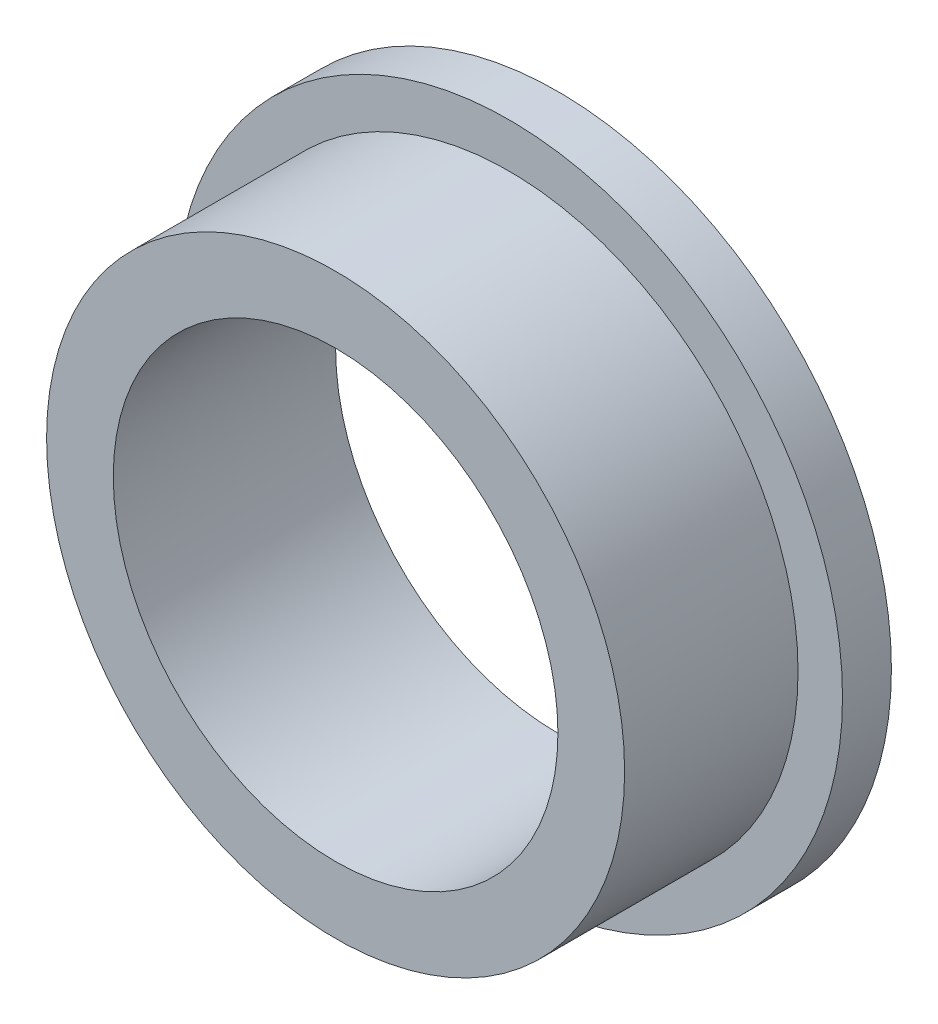
ISO-10303-21;
HEADER;
FILE_DESCRIPTION(('STEP AP214'),'2;1');
FILE_NAME('part.step','',(''),(''),'','','');
FILE_SCHEMA(('AUTOMOTIVE_DESIGN { 1 0 10303 214 1 1 1 1 }'));
ENDSEC;
DATA;
#1=APPLICATION_CONTEXT('core data for automotive mechanical design processes');
#2=APPLICATION_PROTOCOL_DEFINITION('international standard','automotive_design',2000,#1);
#3=PRODUCT_CONTEXT('',#1,'mechanical');
#4=PRODUCT('Part','Part','',(#3));
#5=PRODUCT_RELATED_PRODUCT_CATEGORY('part','',(#4));
#6=PRODUCT_DEFINITION_FORMATION('','',#4);
#7=PRODUCT_DEFINITION_CONTEXT('part definition',#1,'design');
#8=PRODUCT_DEFINITION('design','',#6,#7);
#9=PRODUCT_DEFINITION_SHAPE('','',#8);
#10=(LENGTH_UNIT() NAMED_UNIT(*) SI_UNIT(.MILLI.,.METRE.));
#11=(NAMED_UNIT(*) PLANE_ANGLE_UNIT() SI_UNIT($,.RADIAN.));
#12=(NAMED_UNIT(*) SI_UNIT($,.STERADIAN.) SOLID_ANGLE_UNIT());
#13=UNCERTAINTY_MEASURE_WITH_UNIT(LENGTH_MEASURE(1.E-05),#10,'distance_accuracy_value','');
#14=(GEOMETRIC_REPRESENTATION_CONTEXT(3) GLOBAL_UNCERTAINTY_ASSIGNED_CONTEXT((#13)) GLOBAL_UNIT_ASSIGNED_CONTEXT((#10,
#11,#12)) REPRESENTATION_CONTEXT('',''));
#15=CARTESIAN_POINT('',(0.,0.,0.));
#16=DIRECTION('',(0.,0.,1.));
#17=DIRECTION('',(1.,0.,0.));
#18=AXIS2_PLACEMENT_3D('',#15,#16,#17);
#19=CARTESIAN_POINT('',(0.,0.,5.));
#20=DIRECTION('',(0.,0.,1.));
#21=DIRECTION('',(1.,0.,0.));
#22=AXIS2_PLACEMENT_3D('',#19,#20,#21);
#23=PLANE('',#22);
#24=CARTESIAN_POINT('',(0.,0.,5.));
#25=DIRECTION('',(0.,0.,1.));
#26=DIRECTION('',(1.,0.,0.));
#27=AXIS2_PLACEMENT_3D('',#24,#25,#26);
#28=CIRCLE('',#27,6.5);
#29=CARTESIAN_POINT('',(6.5,0.,5.));
#30=VERTEX_POINT('',#29);
#31=EDGE_CURVE('E10',#30,#30,#28,.T.);
#32=ORIENTED_EDGE('',*,*,#31,.T.);
#33=EDGE_LOOP('',(#32));
#34=FACE_BOUND('',#33,.T.);
#35=CARTESIAN_POINT('',(0.,0.,5.));
#36=DIRECTION('',(0.,0.,1.));
#37=DIRECTION('',(1.,0.,0.));
#38=AXIS2_PLACEMENT_3D('',#35,#36,#37);
#39=CIRCLE('',#38,5.);
#40=CARTESIAN_POINT('',(5.,0.,5.));
#41=VERTEX_POINT('',#40);
#42=EDGE_CURVE('E39',#41,#41,#39,.T.);
#43=ORIENTED_EDGE('',*,*,#42,.F.);
#44=EDGE_LOOP('',(#43));
#45=FACE_BOUND('',#44,.T.);
#46=ADVANCED_FACE('F32',(#34,#45),#23,.T.);
#47=CARTESIAN_POINT('',(0.,0.,0.));
#48=DIRECTION('',(0.,0.,1.));
#49=DIRECTION('',(1.,0.,0.));
#50=AXIS2_PLACEMENT_3D('',#47,#48,#49);
#51=PLANE('',#50);
#52=CARTESIAN_POINT('',(0.,0.,0.));
#53=DIRECTION('',(0.,0.,1.));
#54=DIRECTION('',(1.,0.,0.));
#55=AXIS2_PLACEMENT_3D('',#52,#53,#54);
#56=CIRCLE('',#55,5.);
#57=CARTESIAN_POINT('',(5.,0.,0.));
#58=VERTEX_POINT('',#57);
#59=EDGE_CURVE('E43',#58,#58,#56,.T.);
#60=ORIENTED_EDGE('',*,*,#59,.T.);
#61=EDGE_LOOP('',(#60));
#62=FACE_BOUND('',#61,.T.);
#63=CARTESIAN_POINT('',(0.,0.,0.));
#64=DIRECTION('',(0.,0.,1.));
#65=DIRECTION('',(1.,0.,0.));
#66=AXIS2_PLACEMENT_3D('',#63,#64,#65);
#67=CIRCLE('',#66,7.5);
#68=CARTESIAN_POINT('',(7.5,0.,0.));
#69=VERTEX_POINT('',#68);
#70=EDGE_CURVE('E50',#69,#69,#67,.T.);
#71=ORIENTED_EDGE('',*,*,#70,.F.);
#72=EDGE_LOOP('',(#71));
#73=FACE_BOUND('',#72,.T.);
#74=ADVANCED_FACE('F75',(#62,#73),#51,.F.);
#75=CARTESIAN_POINT('',(0.,0.,5.));
#76=DIRECTION('',(0.,0.,-1.));
#77=DIRECTION('',(-1.,0.,0.));
#78=AXIS2_PLACEMENT_3D('',#75,#76,#77);
#79=CYLINDRICAL_SURFACE('',#78,6.5);
#80=CARTESIAN_POINT('',(0.,0.,1.1));
#81=DIRECTION('',(0.,0.,1.));
#82=DIRECTION('',(1.,0.,0.));
#83=AXIS2_PLACEMENT_3D('',#80,#81,#82);
#84=CIRCLE('',#83,6.5);
#85=CARTESIAN_POINT('',(6.5,0.,1.1));
#86=VERTEX_POINT('',#85);
#87=EDGE_CURVE('E53',#86,#86,#84,.T.);
#88=ORIENTED_EDGE('',*,*,#87,.T.);
#89=EDGE_LOOP('',(#88));
#90=FACE_BOUND('',#89,.T.);
#91=ORIENTED_EDGE('',*,*,#31,.F.);
#92=EDGE_LOOP('',(#91));
#93=FACE_BOUND('',#92,.T.);
#94=ADVANCED_FACE('F34',(#90,#93),#79,.T.);
#95=CARTESIAN_POINT('',(0.,0.,5.));
#96=DIRECTION('',(0.,0.,-1.));
#97=DIRECTION('',(-1.,0.,0.));
#98=AXIS2_PLACEMENT_3D('',#95,#96,#97);
#99=CYLINDRICAL_SURFACE('',#98,5.);
#100=ORIENTED_EDGE('',*,*,#42,.T.);
#101=EDGE_LOOP('',(#100));
#102=FACE_BOUND('',#101,.T.);
#103=ORIENTED_EDGE('',*,*,#59,.F.);
#104=EDGE_LOOP('',(#103));
#105=FACE_BOUND('',#104,.T.);
#106=ADVANCED_FACE('F64',(#102,#105),#99,.F.);
#107=CARTESIAN_POINT('',(0.,0.,1.1));
#108=DIRECTION('',(0.,0.,1.));
#109=DIRECTION('',(1.,0.,0.));
#110=AXIS2_PLACEMENT_3D('',#107,#108,#109);
#111=PLANE('',#110);
#112=CARTESIAN_POINT('',(0.,0.,1.1));
#113=DIRECTION('',(0.,0.,1.));
#114=DIRECTION('',(1.,0.,0.));
#115=AXIS2_PLACEMENT_3D('',#112,#113,#114);
#116=CIRCLE('',#115,7.5);
#117=CARTESIAN_POINT('',(7.5,0.,1.1));
#118=VERTEX_POINT('',#117);
#119=EDGE_CURVE('E48',#118,#118,#116,.T.);
#120=ORIENTED_EDGE('',*,*,#119,.T.);
#121=EDGE_LOOP('',(#120));
#122=FACE_BOUND('',#121,.T.);
#123=ORIENTED_EDGE('',*,*,#87,.F.);
#124=EDGE_LOOP('',(#123));
#125=FACE_BOUND('',#124,.T.);
#126=ADVANCED_FACE('F61',(#122,#125),#111,.T.);
#127=CARTESIAN_POINT('',(0.,0.,1.1));
#128=DIRECTION('',(0.,0.,-1.));
#129=DIRECTION('',(-1.,0.,0.));
#130=AXIS2_PLACEMENT_3D('',#127,#128,#129);
#131=CYLINDRICAL_SURFACE('',#130,7.5);
#132=ORIENTED_EDGE('',*,*,#119,.F.);
#133=EDGE_LOOP('',(#132));
#134=FACE_BOUND('',#133,.T.);
#135=ORIENTED_EDGE('',*,*,#70,.T.);
#136=EDGE_LOOP('',(#135));
#137=FACE_BOUND('',#136,.T.);
#138=ADVANCED_FACE('F63',(#134,#137),#131,.T.);
#139=CLOSED_SHELL('',(#46,#74,#94,#106,#126,#138));
#140=MANIFOLD_SOLID_BREP('B2',#139);
#141=ADVANCED_BREP_SHAPE_REPRESENTATION('',(#18,#140),#14);
#142=SHAPE_DEFINITION_REPRESENTATION(#9,#141);
ENDSEC;
END-ISO-10303-21;
